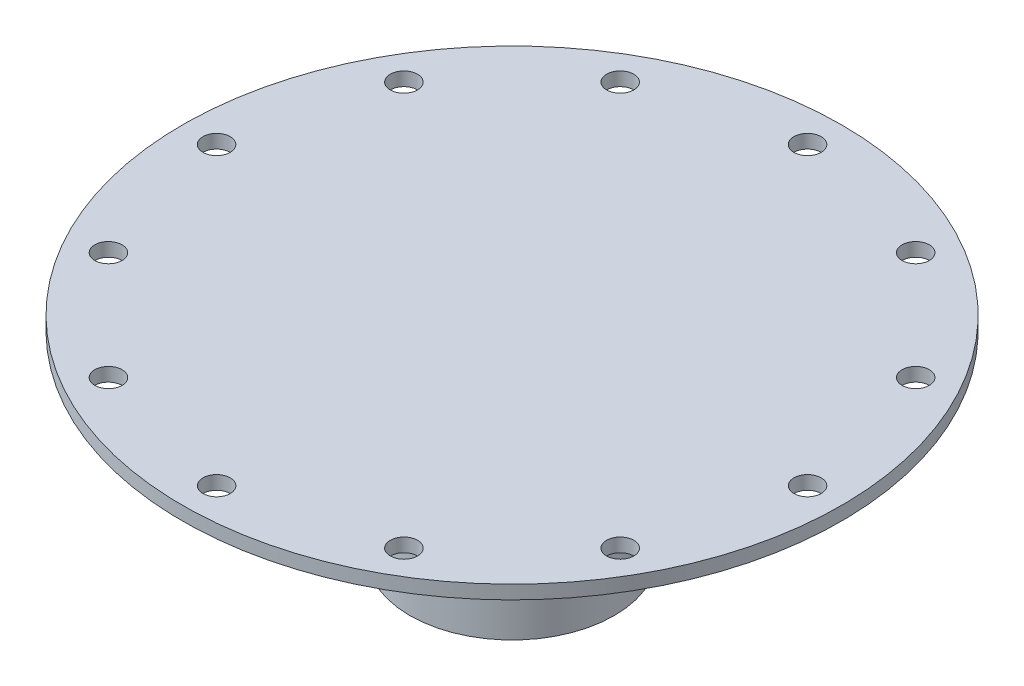
ISO-10303-21;
HEADER;
FILE_DESCRIPTION(('STEP AP214'),'2;1');
FILE_NAME('part.step','',(''),(''),'','','');
FILE_SCHEMA(('AUTOMOTIVE_DESIGN { 1 0 10303 214 1 1 1 1 }'));
ENDSEC;
DATA;
#1=APPLICATION_CONTEXT('core data for automotive mechanical design processes');
#2=APPLICATION_PROTOCOL_DEFINITION('international standard','automotive_design',2000,#1);
#3=PRODUCT_CONTEXT('',#1,'mechanical');
#4=PRODUCT('Part','Part','',(#3));
#5=PRODUCT_RELATED_PRODUCT_CATEGORY('part','',(#4));
#6=PRODUCT_DEFINITION_FORMATION('','',#4);
#7=PRODUCT_DEFINITION_CONTEXT('part definition',#1,'design');
#8=PRODUCT_DEFINITION('design','',#6,#7);
#9=PRODUCT_DEFINITION_SHAPE('','',#8);
#10=(LENGTH_UNIT() NAMED_UNIT(*) SI_UNIT(.MILLI.,.METRE.));
#11=(NAMED_UNIT(*) PLANE_ANGLE_UNIT() SI_UNIT($,.RADIAN.));
#12=(NAMED_UNIT(*) SI_UNIT($,.STERADIAN.) SOLID_ANGLE_UNIT());
#13=UNCERTAINTY_MEASURE_WITH_UNIT(LENGTH_MEASURE(1.E-05),#10,'distance_accuracy_value','');
#14=(GEOMETRIC_REPRESENTATION_CONTEXT(3) GLOBAL_UNCERTAINTY_ASSIGNED_CONTEXT((#13)) GLOBAL_UNIT_ASSIGNED_CONTEXT((#10,
#11,#12)) REPRESENTATION_CONTEXT('',''));
#15=CARTESIAN_POINT('',(0.,0.,0.));
#16=DIRECTION('',(0.,0.,1.));
#17=DIRECTION('',(1.,0.,0.));
#18=AXIS2_PLACEMENT_3D('',#15,#16,#17);
#19=CARTESIAN_POINT('',(0.,-40.,0.));
#20=DIRECTION('',(0.,1.,0.));
#21=DIRECTION('',(0.,0.,1.));
#22=AXIS2_PLACEMENT_3D('',#19,#20,#21);
#23=PLANE('',#22);
#24=CARTESIAN_POINT('',(0.,-40.,0.));
#25=DIRECTION('',(0.,1.,0.));
#26=DIRECTION('',(0.,0.,1.));
#27=AXIS2_PLACEMENT_3D('',#24,#25,#26);
#28=CIRCLE('',#27,22.5);
#29=CARTESIAN_POINT('',(0.,-40.,22.5));
#30=VERTEX_POINT('',#29);
#31=EDGE_CURVE('E10',#30,#30,#28,.T.);
#32=ORIENTED_EDGE('',*,*,#31,.F.);
#33=EDGE_LOOP('',(#32));
#34=FACE_BOUND('',#33,.T.);
#35=ADVANCED_FACE('F31',(#34),#23,.F.);
#36=CARTESIAN_POINT('',(0.,5.99999999999999,0.));
#37=DIRECTION('',(0.,1.,0.));
#38=DIRECTION('',(0.,0.,1.));
#39=AXIS2_PLACEMENT_3D('',#36,#37,#38);
#40=CYLINDRICAL_SURFACE('',#39,22.5);
#41=CARTESIAN_POINT('',(0.,0.,0.));
#42=DIRECTION('',(0.,1.,0.));
#43=DIRECTION('',(0.,0.,1.));
#44=AXIS2_PLACEMENT_3D('',#41,#42,#43);
#45=CIRCLE('',#44,22.5);
#46=CARTESIAN_POINT('',(0.,0.,22.5));
#47=VERTEX_POINT('',#46);
#48=EDGE_CURVE('E39',#47,#47,#45,.T.);
#49=ORIENTED_EDGE('',*,*,#48,.F.);
#50=EDGE_LOOP('',(#49));
#51=FACE_BOUND('',#50,.T.);
#52=ORIENTED_EDGE('',*,*,#31,.T.);
#53=EDGE_LOOP('',(#52));
#54=FACE_BOUND('',#53,.T.);
#55=ADVANCED_FACE('F150',(#51,#54),#40,.T.);
#56=CARTESIAN_POINT('',(0.,0.,-22.5));
#57=DIRECTION('',(0.,1.,0.));
#58=DIRECTION('',(0.,0.,1.));
#59=AXIS2_PLACEMENT_3D('',#56,#57,#58);
#60=PLANE('',#59);
#61=CARTESIAN_POINT('',(0.,0.,0.));
#62=DIRECTION('',(0.,1.,0.));
#63=DIRECTION('',(0.,0.,1.));
#64=AXIS2_PLACEMENT_3D('',#61,#62,#63);
#65=CIRCLE('',#64,50.);
#66=CARTESIAN_POINT('',(0.,0.,50.));
#67=VERTEX_POINT('',#66);
#68=EDGE_CURVE('E43',#67,#67,#65,.T.);
#69=ORIENTED_EDGE('',*,*,#68,.F.);
#70=EDGE_LOOP('',(#69));
#71=FACE_BOUND('',#70,.T.);
#72=ORIENTED_EDGE('',*,*,#48,.T.);
#73=EDGE_LOOP('',(#72));
#74=FACE_BOUND('',#73,.T.);
#75=ADVANCED_FACE('F143',(#71,#74),#60,.F.);
#76=CARTESIAN_POINT('',(0.,5.99999999999999,0.));
#77=DIRECTION('',(0.,1.,0.));
#78=DIRECTION('',(0.,0.,1.));
#79=AXIS2_PLACEMENT_3D('',#76,#77,#78);
#80=CYLINDRICAL_SURFACE('',#79,50.);
#81=CARTESIAN_POINT('',(0.,3.,0.));
#82=DIRECTION('',(0.,-1.,0.));
#83=DIRECTION('',(0.,0.,-1.));
#84=AXIS2_PLACEMENT_3D('',#81,#82,#83);
#85=CIRCLE('',#84,50.);
#86=CARTESIAN_POINT('',(0.,3.,-50.));
#87=VERTEX_POINT('',#86);
#88=EDGE_CURVE('E35',#87,#87,#85,.T.);
#89=ORIENTED_EDGE('',*,*,#88,.T.);
#90=EDGE_LOOP('',(#89));
#91=FACE_BOUND('',#90,.T.);
#92=ORIENTED_EDGE('',*,*,#68,.T.);
#93=EDGE_LOOP('',(#92));
#94=FACE_BOUND('',#93,.T.);
#95=ADVANCED_FACE('F133',(#91,#94),#80,.T.);
#96=CARTESIAN_POINT('',(0.,3.,0.));
#97=DIRECTION('',(0.,-1.,0.));
#98=DIRECTION('',(0.,0.,-1.));
#99=AXIS2_PLACEMENT_3D('',#96,#97,#98);
#100=PLANE('',#99);
#101=ORIENTED_EDGE('',*,*,#88,.F.);
#102=EDGE_LOOP('',(#101));
#103=FACE_BOUND('',#102,.T.);
#104=CARTESIAN_POINT('',(56.2916512459885,3.,32.4999999999999));
#105=DIRECTION('',(0.,-1.,0.));
#106=DIRECTION('',(0.,0.,-1.));
#107=AXIS2_PLACEMENT_3D('',#104,#105,#106);
#108=CIRCLE('',#107,3.);
#109=CARTESIAN_POINT('',(56.2916512459885,3.,29.4999999999999));
#110=VERTEX_POINT('',#109);
#111=EDGE_CURVE('E112',#110,#110,#108,.T.);
#112=ORIENTED_EDGE('',*,*,#111,.F.);
#113=EDGE_LOOP('',(#112));
#114=FACE_BOUND('',#113,.T.);
#115=CARTESIAN_POINT('',(56.2916512459885,3.,-32.5));
#116=DIRECTION('',(0.,-1.,0.));
#117=DIRECTION('',(0.,0.,-1.));
#118=AXIS2_PLACEMENT_3D('',#115,#116,#117);
#119=CIRCLE('',#118,3.);
#120=CARTESIAN_POINT('',(56.2916512459885,3.,-35.5));
#121=VERTEX_POINT('',#120);
#122=EDGE_CURVE('E100',#121,#121,#119,.T.);
#123=ORIENTED_EDGE('',*,*,#122,.F.);
#124=EDGE_LOOP('',(#123));
#125=FACE_BOUND('',#124,.T.);
#126=CARTESIAN_POINT('',(0.,3.,-65.));
#127=DIRECTION('',(0.,-1.,0.));
#128=DIRECTION('',(0.,0.,-1.));
#129=AXIS2_PLACEMENT_3D('',#126,#127,#128);
#130=CIRCLE('',#129,3.);
#131=CARTESIAN_POINT('',(0.,3.,-68.));
#132=VERTEX_POINT('',#131);
#133=EDGE_CURVE('E88',#132,#132,#130,.T.);
#134=ORIENTED_EDGE('',*,*,#133,.F.);
#135=EDGE_LOOP('',(#134));
#136=FACE_BOUND('',#135,.T.);
#137=CARTESIAN_POINT('',(-56.2916512459885,3.,-32.5));
#138=DIRECTION('',(0.,-1.,0.));
#139=DIRECTION('',(0.,0.,-1.));
#140=AXIS2_PLACEMENT_3D('',#137,#138,#139);
#141=CIRCLE('',#140,3.);
#142=CARTESIAN_POINT('',(-56.2916512459885,3.,-35.5));
#143=VERTEX_POINT('',#142);
#144=EDGE_CURVE('E76',#143,#143,#141,.T.);
#145=ORIENTED_EDGE('',*,*,#144,.F.);
#146=EDGE_LOOP('',(#145));
#147=FACE_BOUND('',#146,.T.);
#148=CARTESIAN_POINT('',(-56.2916512459885,3.,32.5));
#149=DIRECTION('',(0.,-1.,0.));
#150=DIRECTION('',(0.,0.,-1.));
#151=AXIS2_PLACEMENT_3D('',#148,#149,#150);
#152=CIRCLE('',#151,3.);
#153=CARTESIAN_POINT('',(-56.2916512459885,3.,29.5));
#154=VERTEX_POINT('',#153);
#155=EDGE_CURVE('E64',#154,#154,#152,.T.);
#156=ORIENTED_EDGE('',*,*,#155,.F.);
#157=EDGE_LOOP('',(#156));
#158=FACE_BOUND('',#157,.T.);
#159=CARTESIAN_POINT('',(0.,3.,65.));
#160=DIRECTION('',(0.,-1.,0.));
#161=DIRECTION('',(0.,0.,-1.));
#162=AXIS2_PLACEMENT_3D('',#159,#160,#161);
#163=CIRCLE('',#162,3.);
#164=CARTESIAN_POINT('',(0.,3.,62.));
#165=VERTEX_POINT('',#164);
#166=EDGE_CURVE('E52',#165,#165,#163,.T.);
#167=ORIENTED_EDGE('',*,*,#166,.F.);
#168=EDGE_LOOP('',(#167));
#169=FACE_BOUND('',#168,.T.);
#170=CARTESIAN_POINT('',(0.,3.,0.));
#171=DIRECTION('',(0.,-1.,0.));
#172=DIRECTION('',(0.,0.,-1.));
#173=AXIS2_PLACEMENT_3D('',#170,#171,#172);
#174=CIRCLE('',#173,72.5);
#175=CARTESIAN_POINT('',(0.,3.,-72.5));
#176=VERTEX_POINT('',#175);
#177=EDGE_CURVE('E51',#176,#176,#174,.T.);
#178=ORIENTED_EDGE('',*,*,#177,.T.);
#179=EDGE_LOOP('',(#178));
#180=FACE_BOUND('',#179,.T.);
#181=CARTESIAN_POINT('',(-32.5,3.,56.2916512459885));
#182=DIRECTION('',(0.,-1.,0.));
#183=DIRECTION('',(0.,0.,-1.));
#184=AXIS2_PLACEMENT_3D('',#181,#182,#183);
#185=CIRCLE('',#184,3.);
#186=CARTESIAN_POINT('',(-32.5,3.,53.2916512459885));
#187=VERTEX_POINT('',#186);
#188=EDGE_CURVE('E58',#187,#187,#185,.T.);
#189=ORIENTED_EDGE('',*,*,#188,.F.);
#190=EDGE_LOOP('',(#189));
#191=FACE_BOUND('',#190,.T.);
#192=CARTESIAN_POINT('',(-65.,3.,0.));
#193=DIRECTION('',(0.,-1.,0.));
#194=DIRECTION('',(0.,0.,-1.));
#195=AXIS2_PLACEMENT_3D('',#192,#193,#194);
#196=CIRCLE('',#195,3.);
#197=CARTESIAN_POINT('',(-65.,3.,-2.99999999999999));
#198=VERTEX_POINT('',#197);
#199=EDGE_CURVE('E70',#198,#198,#196,.T.);
#200=ORIENTED_EDGE('',*,*,#199,.F.);
#201=EDGE_LOOP('',(#200));
#202=FACE_BOUND('',#201,.T.);
#203=CARTESIAN_POINT('',(-32.5,3.,-56.2916512459885));
#204=DIRECTION('',(0.,-1.,0.));
#205=DIRECTION('',(0.,0.,-1.));
#206=AXIS2_PLACEMENT_3D('',#203,#204,#205);
#207=CIRCLE('',#206,3.);
#208=CARTESIAN_POINT('',(-32.5,3.,-59.2916512459885));
#209=VERTEX_POINT('',#208);
#210=EDGE_CURVE('E82',#209,#209,#207,.T.);
#211=ORIENTED_EDGE('',*,*,#210,.F.);
#212=EDGE_LOOP('',(#211));
#213=FACE_BOUND('',#212,.T.);
#214=CARTESIAN_POINT('',(32.5,3.,-56.2916512459885));
#215=DIRECTION('',(0.,-1.,0.));
#216=DIRECTION('',(0.,0.,-1.));
#217=AXIS2_PLACEMENT_3D('',#214,#215,#216);
#218=CIRCLE('',#217,3.);
#219=CARTESIAN_POINT('',(32.5,3.,-59.2916512459885));
#220=VERTEX_POINT('',#219);
#221=EDGE_CURVE('E94',#220,#220,#218,.T.);
#222=ORIENTED_EDGE('',*,*,#221,.F.);
#223=EDGE_LOOP('',(#222));
#224=FACE_BOUND('',#223,.T.);
#225=CARTESIAN_POINT('',(65.,3.,0.));
#226=DIRECTION('',(0.,-1.,0.));
#227=DIRECTION('',(0.,0.,-1.));
#228=AXIS2_PLACEMENT_3D('',#225,#226,#227);
#229=CIRCLE('',#228,3.00000000000001);
#230=CARTESIAN_POINT('',(65.,3.,-3.00000000000003));
#231=VERTEX_POINT('',#230);
#232=EDGE_CURVE('E106',#231,#231,#229,.T.);
#233=ORIENTED_EDGE('',*,*,#232,.F.);
#234=EDGE_LOOP('',(#233));
#235=FACE_BOUND('',#234,.T.);
#236=CARTESIAN_POINT('',(32.5000000000001,3.,56.2916512459885));
#237=DIRECTION('',(0.,-1.,0.));
#238=DIRECTION('',(0.,0.,-1.));
#239=AXIS2_PLACEMENT_3D('',#236,#237,#238);
#240=CIRCLE('',#239,2.99999999999999);
#241=CARTESIAN_POINT('',(32.5000000000001,3.,53.2916512459885));
#242=VERTEX_POINT('',#241);
#243=EDGE_CURVE('E118',#242,#242,#240,.T.);
#244=ORIENTED_EDGE('',*,*,#243,.F.);
#245=EDGE_LOOP('',(#244));
#246=FACE_BOUND('',#245,.T.);
#247=ADVANCED_FACE('F130',(#103,#114,#125,#136,#147,#158,#169,#180,#191,#202,#213,#224,#235,
#246),#100,.T.);
#248=CARTESIAN_POINT('',(0.,3.,0.));
#249=DIRECTION('',(0.,1.,0.));
#250=DIRECTION('',(0.,0.,1.));
#251=AXIS2_PLACEMENT_3D('',#248,#249,#250);
#252=CYLINDRICAL_SURFACE('',#251,72.5);
#253=ORIENTED_EDGE('',*,*,#177,.F.);
#254=EDGE_LOOP('',(#253));
#255=FACE_BOUND('',#254,.T.);
#256=CARTESIAN_POINT('',(0.,6.,0.));
#257=DIRECTION('',(0.,-1.,0.));
#258=DIRECTION('',(0.,0.,-1.));
#259=AXIS2_PLACEMENT_3D('',#256,#257,#258);
#260=CIRCLE('',#259,72.5);
#261=CARTESIAN_POINT('',(0.,6.,-72.5));
#262=VERTEX_POINT('',#261);
#263=EDGE_CURVE('E48',#262,#262,#260,.T.);
#264=ORIENTED_EDGE('',*,*,#263,.T.);
#265=EDGE_LOOP('',(#264));
#266=FACE_BOUND('',#265,.T.);
#267=ADVANCED_FACE('F132',(#255,#266),#252,.T.);
#268=CARTESIAN_POINT('',(0.,3.,65.));
#269=DIRECTION('',(0.,1.,0.));
#270=DIRECTION('',(0.,0.,1.));
#271=AXIS2_PLACEMENT_3D('',#268,#269,#270);
#272=CYLINDRICAL_SURFACE('',#271,3.);
#273=ORIENTED_EDGE('',*,*,#166,.T.);
#274=EDGE_LOOP('',(#273));
#275=FACE_BOUND('',#274,.T.);
#276=CARTESIAN_POINT('',(0.,6.,65.));
#277=DIRECTION('',(0.,-1.,0.));
#278=DIRECTION('',(0.,0.,-1.));
#279=AXIS2_PLACEMENT_3D('',#276,#277,#278);
#280=CIRCLE('',#279,3.);
#281=CARTESIAN_POINT('',(0.,6.,62.));
#282=VERTEX_POINT('',#281);
#283=EDGE_CURVE('E55',#282,#282,#280,.T.);
#284=ORIENTED_EDGE('',*,*,#283,.F.);
#285=EDGE_LOOP('',(#284));
#286=FACE_BOUND('',#285,.T.);
#287=ADVANCED_FACE('F140',(#275,#286),#272,.F.);
#288=CARTESIAN_POINT('',(-32.5,3.,56.2916512459885));
#289=DIRECTION('',(0.,1.,0.));
#290=DIRECTION('',(0.,0.,1.));
#291=AXIS2_PLACEMENT_3D('',#288,#289,#290);
#292=CYLINDRICAL_SURFACE('',#291,3.);
#293=ORIENTED_EDGE('',*,*,#188,.T.);
#294=EDGE_LOOP('',(#293));
#295=FACE_BOUND('',#294,.T.);
#296=CARTESIAN_POINT('',(-32.5,6.,56.2916512459885));
#297=DIRECTION('',(0.,-1.,0.));
#298=DIRECTION('',(0.,0.,-1.));
#299=AXIS2_PLACEMENT_3D('',#296,#297,#298);
#300=CIRCLE('',#299,3.);
#301=CARTESIAN_POINT('',(-32.5,6.,53.2916512459885));
#302=VERTEX_POINT('',#301);
#303=EDGE_CURVE('E61',#302,#302,#300,.T.);
#304=ORIENTED_EDGE('',*,*,#303,.F.);
#305=EDGE_LOOP('',(#304));
#306=FACE_BOUND('',#305,.T.);
#307=ADVANCED_FACE('F191',(#295,#306),#292,.F.);
#308=CARTESIAN_POINT('',(-56.2916512459885,3.,32.5));
#309=DIRECTION('',(0.,1.,0.));
#310=DIRECTION('',(0.,0.,1.));
#311=AXIS2_PLACEMENT_3D('',#308,#309,#310);
#312=CYLINDRICAL_SURFACE('',#311,3.);
#313=ORIENTED_EDGE('',*,*,#155,.T.);
#314=EDGE_LOOP('',(#313));
#315=FACE_BOUND('',#314,.T.);
#316=CARTESIAN_POINT('',(-56.2916512459885,6.,32.5));
#317=DIRECTION('',(0.,-1.,0.));
#318=DIRECTION('',(0.,0.,-1.));
#319=AXIS2_PLACEMENT_3D('',#316,#317,#318);
#320=CIRCLE('',#319,3.);
#321=CARTESIAN_POINT('',(-56.2916512459885,6.,29.5));
#322=VERTEX_POINT('',#321);
#323=EDGE_CURVE('E67',#322,#322,#320,.T.);
#324=ORIENTED_EDGE('',*,*,#323,.F.);
#325=EDGE_LOOP('',(#324));
#326=FACE_BOUND('',#325,.T.);
#327=ADVANCED_FACE('F200',(#315,#326),#312,.F.);
#328=CARTESIAN_POINT('',(-65.,3.,0.));
#329=DIRECTION('',(0.,1.,0.));
#330=DIRECTION('',(0.,0.,1.));
#331=AXIS2_PLACEMENT_3D('',#328,#329,#330);
#332=CYLINDRICAL_SURFACE('',#331,3.);
#333=ORIENTED_EDGE('',*,*,#199,.T.);
#334=EDGE_LOOP('',(#333));
#335=FACE_BOUND('',#334,.T.);
#336=CARTESIAN_POINT('',(-65.,6.,0.));
#337=DIRECTION('',(0.,-1.,0.));
#338=DIRECTION('',(0.,0.,-1.));
#339=AXIS2_PLACEMENT_3D('',#336,#337,#338);
#340=CIRCLE('',#339,3.);
#341=CARTESIAN_POINT('',(-65.,6.,-2.99999999999999));
#342=VERTEX_POINT('',#341);
#343=EDGE_CURVE('E73',#342,#342,#340,.T.);
#344=ORIENTED_EDGE('',*,*,#343,.F.);
#345=EDGE_LOOP('',(#344));
#346=FACE_BOUND('',#345,.T.);
#347=ADVANCED_FACE('F210',(#335,#346),#332,.F.);
#348=CARTESIAN_POINT('',(-56.2916512459885,3.,-32.5));
#349=DIRECTION('',(0.,1.,0.));
#350=DIRECTION('',(0.,0.,1.));
#351=AXIS2_PLACEMENT_3D('',#348,#349,#350);
#352=CYLINDRICAL_SURFACE('',#351,3.);
#353=ORIENTED_EDGE('',*,*,#144,.T.);
#354=EDGE_LOOP('',(#353));
#355=FACE_BOUND('',#354,.T.);
#356=CARTESIAN_POINT('',(-56.2916512459885,6.,-32.5));
#357=DIRECTION('',(0.,-1.,0.));
#358=DIRECTION('',(0.,0.,-1.));
#359=AXIS2_PLACEMENT_3D('',#356,#357,#358);
#360=CIRCLE('',#359,3.);
#361=CARTESIAN_POINT('',(-56.2916512459885,6.,-35.5));
#362=VERTEX_POINT('',#361);
#363=EDGE_CURVE('E79',#362,#362,#360,.T.);
#364=ORIENTED_EDGE('',*,*,#363,.F.);
#365=EDGE_LOOP('',(#364));
#366=FACE_BOUND('',#365,.T.);
#367=ADVANCED_FACE('F220',(#355,#366),#352,.F.);
#368=CARTESIAN_POINT('',(-32.5,3.,-56.2916512459885));
#369=DIRECTION('',(0.,1.,0.));
#370=DIRECTION('',(0.,0.,1.));
#371=AXIS2_PLACEMENT_3D('',#368,#369,#370);
#372=CYLINDRICAL_SURFACE('',#371,3.);
#373=ORIENTED_EDGE('',*,*,#210,.T.);
#374=EDGE_LOOP('',(#373));
#375=FACE_BOUND('',#374,.T.);
#376=CARTESIAN_POINT('',(-32.5,6.,-56.2916512459885));
#377=DIRECTION('',(0.,-1.,0.));
#378=DIRECTION('',(0.,0.,-1.));
#379=AXIS2_PLACEMENT_3D('',#376,#377,#378);
#380=CIRCLE('',#379,3.);
#381=CARTESIAN_POINT('',(-32.5,6.,-59.2916512459885));
#382=VERTEX_POINT('',#381);
#383=EDGE_CURVE('E85',#382,#382,#380,.T.);
#384=ORIENTED_EDGE('',*,*,#383,.F.);
#385=EDGE_LOOP('',(#384));
#386=FACE_BOUND('',#385,.T.);
#387=ADVANCED_FACE('F230',(#375,#386),#372,.F.);
#388=CARTESIAN_POINT('',(0.,3.,-65.));
#389=DIRECTION('',(0.,1.,0.));
#390=DIRECTION('',(0.,0.,1.));
#391=AXIS2_PLACEMENT_3D('',#388,#389,#390);
#392=CYLINDRICAL_SURFACE('',#391,3.);
#393=ORIENTED_EDGE('',*,*,#133,.T.);
#394=EDGE_LOOP('',(#393));
#395=FACE_BOUND('',#394,.T.);
#396=CARTESIAN_POINT('',(0.,6.,-65.));
#397=DIRECTION('',(0.,-1.,0.));
#398=DIRECTION('',(0.,0.,-1.));
#399=AXIS2_PLACEMENT_3D('',#396,#397,#398);
#400=CIRCLE('',#399,3.);
#401=CARTESIAN_POINT('',(0.,6.,-68.));
#402=VERTEX_POINT('',#401);
#403=EDGE_CURVE('E91',#402,#402,#400,.T.);
#404=ORIENTED_EDGE('',*,*,#403,.F.);
#405=EDGE_LOOP('',(#404));
#406=FACE_BOUND('',#405,.T.);
#407=ADVANCED_FACE('F240',(#395,#406),#392,.F.);
#408=CARTESIAN_POINT('',(32.5,3.,-56.2916512459885));
#409=DIRECTION('',(0.,1.,0.));
#410=DIRECTION('',(0.,0.,1.));
#411=AXIS2_PLACEMENT_3D('',#408,#409,#410);
#412=CYLINDRICAL_SURFACE('',#411,3.);
#413=ORIENTED_EDGE('',*,*,#221,.T.);
#414=EDGE_LOOP('',(#413));
#415=FACE_BOUND('',#414,.T.);
#416=CARTESIAN_POINT('',(32.5,6.,-56.2916512459885));
#417=DIRECTION('',(0.,-1.,0.));
#418=DIRECTION('',(0.,0.,-1.));
#419=AXIS2_PLACEMENT_3D('',#416,#417,#418);
#420=CIRCLE('',#419,3.);
#421=CARTESIAN_POINT('',(32.5,6.,-59.2916512459885));
#422=VERTEX_POINT('',#421);
#423=EDGE_CURVE('E97',#422,#422,#420,.T.);
#424=ORIENTED_EDGE('',*,*,#423,.F.);
#425=EDGE_LOOP('',(#424));
#426=FACE_BOUND('',#425,.T.);
#427=ADVANCED_FACE('F250',(#415,#426),#412,.F.);
#428=CARTESIAN_POINT('',(56.2916512459885,3.,-32.5));
#429=DIRECTION('',(0.,1.,0.));
#430=DIRECTION('',(0.,0.,1.));
#431=AXIS2_PLACEMENT_3D('',#428,#429,#430);
#432=CYLINDRICAL_SURFACE('',#431,3.);
#433=ORIENTED_EDGE('',*,*,#122,.T.);
#434=EDGE_LOOP('',(#433));
#435=FACE_BOUND('',#434,.T.);
#436=CARTESIAN_POINT('',(56.2916512459885,6.,-32.5));
#437=DIRECTION('',(0.,-1.,0.));
#438=DIRECTION('',(0.,0.,-1.));
#439=AXIS2_PLACEMENT_3D('',#436,#437,#438);
#440=CIRCLE('',#439,3.);
#441=CARTESIAN_POINT('',(56.2916512459885,6.,-35.5));
#442=VERTEX_POINT('',#441);
#443=EDGE_CURVE('E103',#442,#442,#440,.T.);
#444=ORIENTED_EDGE('',*,*,#443,.F.);
#445=EDGE_LOOP('',(#444));
#446=FACE_BOUND('',#445,.T.);
#447=ADVANCED_FACE('F260',(#435,#446),#432,.F.);
#448=CARTESIAN_POINT('',(65.,3.,0.));
#449=DIRECTION('',(0.,1.,0.));
#450=DIRECTION('',(0.,0.,1.));
#451=AXIS2_PLACEMENT_3D('',#448,#449,#450);
#452=CYLINDRICAL_SURFACE('',#451,3.00000000000001);
#453=ORIENTED_EDGE('',*,*,#232,.T.);
#454=EDGE_LOOP('',(#453));
#455=FACE_BOUND('',#454,.T.);
#456=CARTESIAN_POINT('',(65.,6.,0.));
#457=DIRECTION('',(0.,-1.,0.));
#458=DIRECTION('',(0.,0.,-1.));
#459=AXIS2_PLACEMENT_3D('',#456,#457,#458);
#460=CIRCLE('',#459,3.00000000000001);
#461=CARTESIAN_POINT('',(65.,6.,-3.00000000000003));
#462=VERTEX_POINT('',#461);
#463=EDGE_CURVE('E109',#462,#462,#460,.T.);
#464=ORIENTED_EDGE('',*,*,#463,.F.);
#465=EDGE_LOOP('',(#464));
#466=FACE_BOUND('',#465,.T.);
#467=ADVANCED_FACE('F270',(#455,#466),#452,.F.);
#468=CARTESIAN_POINT('',(56.2916512459885,3.,32.4999999999999));
#469=DIRECTION('',(0.,1.,0.));
#470=DIRECTION('',(0.,0.,1.));
#471=AXIS2_PLACEMENT_3D('',#468,#469,#470);
#472=CYLINDRICAL_SURFACE('',#471,3.);
#473=ORIENTED_EDGE('',*,*,#111,.T.);
#474=EDGE_LOOP('',(#473));
#475=FACE_BOUND('',#474,.T.);
#476=CARTESIAN_POINT('',(56.2916512459885,6.,32.4999999999999));
#477=DIRECTION('',(0.,-1.,0.));
#478=DIRECTION('',(0.,0.,-1.));
#479=AXIS2_PLACEMENT_3D('',#476,#477,#478);
#480=CIRCLE('',#479,3.);
#481=CARTESIAN_POINT('',(56.2916512459885,6.,29.4999999999999));
#482=VERTEX_POINT('',#481);
#483=EDGE_CURVE('E115',#482,#482,#480,.T.);
#484=ORIENTED_EDGE('',*,*,#483,.F.);
#485=EDGE_LOOP('',(#484));
#486=FACE_BOUND('',#485,.T.);
#487=ADVANCED_FACE('F280',(#475,#486),#472,.F.);
#488=CARTESIAN_POINT('',(32.5000000000001,3.,56.2916512459885));
#489=DIRECTION('',(0.,1.,0.));
#490=DIRECTION('',(0.,0.,1.));
#491=AXIS2_PLACEMENT_3D('',#488,#489,#490);
#492=CYLINDRICAL_SURFACE('',#491,2.99999999999999);
#493=ORIENTED_EDGE('',*,*,#243,.T.);
#494=EDGE_LOOP('',(#493));
#495=FACE_BOUND('',#494,.T.);
#496=CARTESIAN_POINT('',(32.5000000000001,6.,56.2916512459885));
#497=DIRECTION('',(0.,-1.,0.));
#498=DIRECTION('',(0.,0.,-1.));
#499=AXIS2_PLACEMENT_3D('',#496,#497,#498);
#500=CIRCLE('',#499,2.99999999999999);
#501=CARTESIAN_POINT('',(32.5000000000001,6.,53.2916512459885));
#502=VERTEX_POINT('',#501);
#503=EDGE_CURVE('E121',#502,#502,#500,.T.);
#504=ORIENTED_EDGE('',*,*,#503,.F.);
#505=EDGE_LOOP('',(#504));
#506=FACE_BOUND('',#505,.T.);
#507=ADVANCED_FACE('F127',(#495,#506),#492,.F.);
#508=CARTESIAN_POINT('',(0.,6.,-50.));
#509=DIRECTION('',(0.,-1.,0.));
#510=DIRECTION('',(0.,0.,-1.));
#511=AXIS2_PLACEMENT_3D('',#508,#509,#510);
#512=PLANE('',#511);
#513=ORIENTED_EDGE('',*,*,#263,.F.);
#514=EDGE_LOOP('',(#513));
#515=FACE_BOUND('',#514,.T.);
#516=ORIENTED_EDGE('',*,*,#283,.T.);
#517=EDGE_LOOP('',(#516));
#518=FACE_BOUND('',#517,.T.);
#519=ORIENTED_EDGE('',*,*,#303,.T.);
#520=EDGE_LOOP('',(#519));
#521=FACE_BOUND('',#520,.T.);
#522=ORIENTED_EDGE('',*,*,#323,.T.);
#523=EDGE_LOOP('',(#522));
#524=FACE_BOUND('',#523,.T.);
#525=ORIENTED_EDGE('',*,*,#343,.T.);
#526=EDGE_LOOP('',(#525));
#527=FACE_BOUND('',#526,.T.);
#528=ORIENTED_EDGE('',*,*,#363,.T.);
#529=EDGE_LOOP('',(#528));
#530=FACE_BOUND('',#529,.T.);
#531=ORIENTED_EDGE('',*,*,#383,.T.);
#532=EDGE_LOOP('',(#531));
#533=FACE_BOUND('',#532,.T.);
#534=ORIENTED_EDGE('',*,*,#403,.T.);
#535=EDGE_LOOP('',(#534));
#536=FACE_BOUND('',#535,.T.);
#537=ORIENTED_EDGE('',*,*,#423,.T.);
#538=EDGE_LOOP('',(#537));
#539=FACE_BOUND('',#538,.T.);
#540=ORIENTED_EDGE('',*,*,#443,.T.);
#541=EDGE_LOOP('',(#540));
#542=FACE_BOUND('',#541,.T.);
#543=ORIENTED_EDGE('',*,*,#463,.T.);
#544=EDGE_LOOP('',(#543));
#545=FACE_BOUND('',#544,.T.);
#546=ORIENTED_EDGE('',*,*,#483,.T.);
#547=EDGE_LOOP('',(#546));
#548=FACE_BOUND('',#547,.T.);
#549=ORIENTED_EDGE('',*,*,#503,.T.);
#550=EDGE_LOOP('',(#549));
#551=FACE_BOUND('',#550,.T.);
#552=ADVANCED_FACE('F33',(#515,#518,#521,#524,#527,#530,#533,#536,#539,#542,#545,#548,#551),
#512,.F.);
#553=CLOSED_SHELL('',(#35,#55,#75,#95,#247,#267,#287,#307,#327,#347,#367,#387,#407,#427,#447,
#467,#487,#507,#552));
#554=MANIFOLD_SOLID_BREP('B2',#553);
#555=ADVANCED_BREP_SHAPE_REPRESENTATION('',(#18,#554),#14);
#556=SHAPE_DEFINITION_REPRESENTATION(#9,#555);
ENDSEC;
END-ISO-10303-21;
